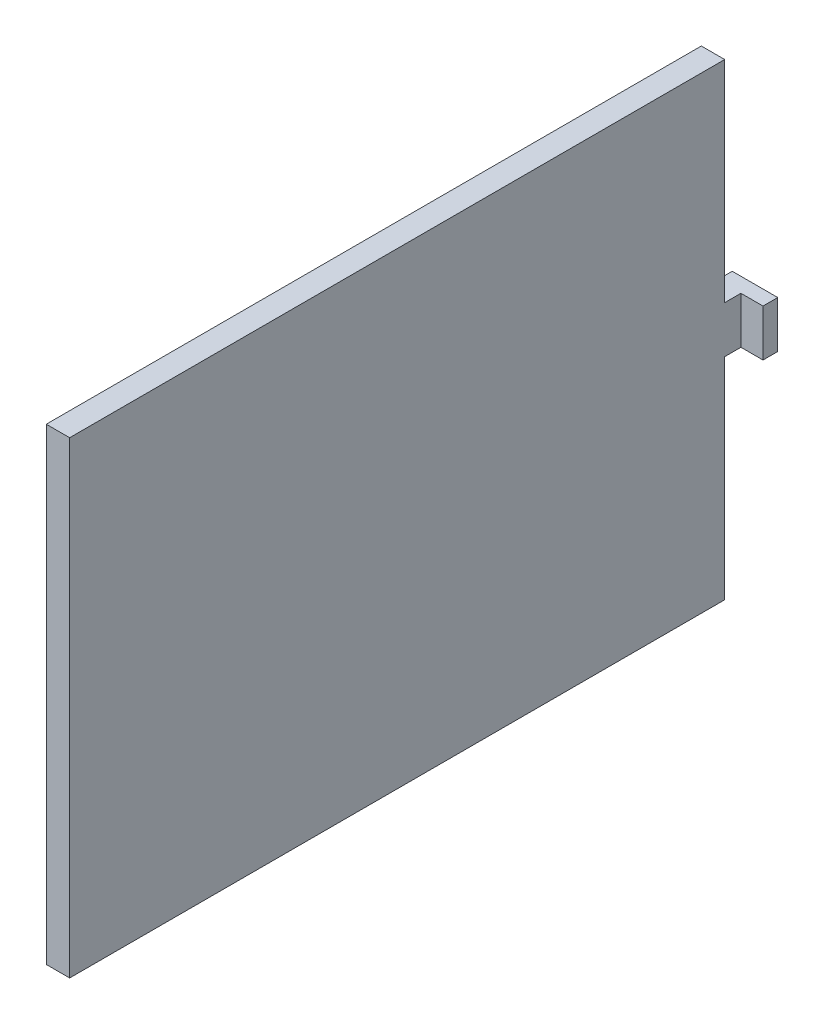
ISO-10303-21;
HEADER;
FILE_DESCRIPTION(('STEP AP214'),'2;1');
FILE_NAME('part.step','',(''),(''),'','','');
FILE_SCHEMA(('AUTOMOTIVE_DESIGN { 1 0 10303 214 1 1 1 1 }'));
ENDSEC;
DATA;
#1=APPLICATION_CONTEXT('core data for automotive mechanical design processes');
#2=APPLICATION_PROTOCOL_DEFINITION('international standard','automotive_design',2000,#1);
#3=PRODUCT_CONTEXT('',#1,'mechanical');
#4=PRODUCT('Part','Part','',(#3));
#5=PRODUCT_RELATED_PRODUCT_CATEGORY('part','',(#4));
#6=PRODUCT_DEFINITION_FORMATION('','',#4);
#7=PRODUCT_DEFINITION_CONTEXT('part definition',#1,'design');
#8=PRODUCT_DEFINITION('design','',#6,#7);
#9=PRODUCT_DEFINITION_SHAPE('','',#8);
#10=(LENGTH_UNIT() NAMED_UNIT(*) SI_UNIT(.MILLI.,.METRE.));
#11=(NAMED_UNIT(*) PLANE_ANGLE_UNIT() SI_UNIT($,.RADIAN.));
#12=(NAMED_UNIT(*) SI_UNIT($,.STERADIAN.) SOLID_ANGLE_UNIT());
#13=UNCERTAINTY_MEASURE_WITH_UNIT(LENGTH_MEASURE(1.E-05),#10,'distance_accuracy_value','');
#14=(GEOMETRIC_REPRESENTATION_CONTEXT(3) GLOBAL_UNCERTAINTY_ASSIGNED_CONTEXT((#13)) GLOBAL_UNIT_ASSIGNED_CONTEXT((#10,
#11,#12)) REPRESENTATION_CONTEXT('',''));
#15=CARTESIAN_POINT('',(0.,0.,0.));
#16=DIRECTION('',(0.,0.,1.));
#17=DIRECTION('',(1.,0.,0.));
#18=AXIS2_PLACEMENT_3D('',#15,#16,#17);
#19=CARTESIAN_POINT('',(0.,0.,0.));
#20=DIRECTION('',(0.,0.,-1.));
#21=DIRECTION('',(-1.,0.,0.));
#22=AXIS2_PLACEMENT_3D('',#19,#20,#21);
#23=PLANE('',#22);
#24=DIRECTION('',(0.,-1.,0.));
#25=VECTOR('',#24,1.);
#26=CARTESIAN_POINT('',(-1.5875,-31.75,0.));
#27=LINE('',#26,#25);
#28=CARTESIAN_POINT('',(-1.5875,-3.175,0.));
#29=VERTEX_POINT('',#28);
#30=CARTESIAN_POINT('',(-1.5875,-31.75,0.));
#31=VERTEX_POINT('',#30);
#32=EDGE_CURVE('E60',#29,#31,#27,.T.);
#33=ORIENTED_EDGE('',*,*,#32,.F.);
#34=DIRECTION('',(1.,0.,0.));
#35=VECTOR('',#34,1.);
#36=CARTESIAN_POINT('',(-1.5875,-3.175,0.));
#37=LINE('',#36,#35);
#38=CARTESIAN_POINT('',(1.5875,-3.175,0.));
#39=VERTEX_POINT('',#38);
#40=EDGE_CURVE('E55',#29,#39,#37,.T.);
#41=ORIENTED_EDGE('',*,*,#40,.T.);
#42=DIRECTION('',(0.,1.,0.));
#43=VECTOR('',#42,1.);
#44=CARTESIAN_POINT('',(1.5875,-31.75,0.));
#45=LINE('',#44,#43);
#46=CARTESIAN_POINT('',(1.5875,-31.75,0.));
#47=VERTEX_POINT('',#46);
#48=EDGE_CURVE('E128',#47,#39,#45,.T.);
#49=ORIENTED_EDGE('',*,*,#48,.F.);
#50=DIRECTION('',(1.,0.,0.));
#51=VECTOR('',#50,1.);
#52=CARTESIAN_POINT('',(-1.5875,-31.75,0.));
#53=LINE('',#52,#51);
#54=EDGE_CURVE('E129',#31,#47,#53,.T.);
#55=ORIENTED_EDGE('',*,*,#54,.F.);
#56=EDGE_LOOP('',(#33,#41,#49,#55));
#57=FACE_BOUND('',#56,.T.);
#58=ADVANCED_FACE('F39',(#57),#23,.T.);
#59=CARTESIAN_POINT('',(-1.5875,-31.75,88.9));
#60=DIRECTION('',(1.,0.,0.));
#61=DIRECTION('',(0.,1.,0.));
#62=AXIS2_PLACEMENT_3D('',#59,#60,#61);
#63=PLANE('',#62);
#64=CARTESIAN_POINT('',(-1.5875,31.75,0.));
#65=VERTEX_POINT('',#64);
#66=CARTESIAN_POINT('',(-1.5875,3.175,0.));
#67=VERTEX_POINT('',#66);
#68=EDGE_CURVE('E203',#65,#67,#27,.T.);
#69=ORIENTED_EDGE('',*,*,#68,.T.);
#70=DIRECTION('',(0.,0.,1.));
#71=VECTOR('',#70,1.);
#72=CARTESIAN_POINT('',(-1.5875,3.175,-4.2));
#73=LINE('',#72,#71);
#74=CARTESIAN_POINT('',(-1.5875,3.175,-4.2));
#75=VERTEX_POINT('',#74);
#76=EDGE_CURVE('E144',#75,#67,#73,.T.);
#77=ORIENTED_EDGE('',*,*,#76,.F.);
#78=DIRECTION('',(0.,-1.,0.));
#79=VECTOR('',#78,1.);
#80=CARTESIAN_POINT('',(-1.5875,3.175,-4.2));
#81=LINE('',#80,#79);
#82=CARTESIAN_POINT('',(-1.5875,-3.175,-4.2));
#83=VERTEX_POINT('',#82);
#84=EDGE_CURVE('E162',#75,#83,#81,.T.);
#85=ORIENTED_EDGE('',*,*,#84,.T.);
#86=DIRECTION('',(0.,0.,1.));
#87=VECTOR('',#86,1.);
#88=CARTESIAN_POINT('',(-1.5875,-3.175,-4.2));
#89=LINE('',#88,#87);
#90=EDGE_CURVE('E146',#83,#29,#89,.T.);
#91=ORIENTED_EDGE('',*,*,#90,.T.);
#92=ORIENTED_EDGE('',*,*,#32,.T.);
#93=DIRECTION('',(0.,0.,-1.));
#94=VECTOR('',#93,1.);
#95=CARTESIAN_POINT('',(-1.5875,-31.75,88.9));
#96=LINE('',#95,#94);
#97=CARTESIAN_POINT('',(-1.5875,-31.75,88.9));
#98=VERTEX_POINT('',#97);
#99=EDGE_CURVE('E11',#98,#31,#96,.T.);
#100=ORIENTED_EDGE('',*,*,#99,.F.);
#101=DIRECTION('',(0.,-1.,0.));
#102=VECTOR('',#101,1.);
#103=CARTESIAN_POINT('',(-1.5875,-31.75,88.9));
#104=LINE('',#103,#102);
#105=CARTESIAN_POINT('',(-1.5875,31.75,88.9));
#106=VERTEX_POINT('',#105);
#107=EDGE_CURVE('E189',#106,#98,#104,.T.);
#108=ORIENTED_EDGE('',*,*,#107,.F.);
#109=DIRECTION('',(0.,0.,-1.));
#110=VECTOR('',#109,1.);
#111=CARTESIAN_POINT('',(-1.5875,31.75,88.9));
#112=LINE('',#111,#110);
#113=EDGE_CURVE('E202',#106,#65,#112,.T.);
#114=ORIENTED_EDGE('',*,*,#113,.T.);
#115=EDGE_LOOP('',(#69,#77,#85,#91,#92,#100,#108,#114));
#116=FACE_BOUND('',#115,.T.);
#117=ADVANCED_FACE('F41',(#116),#63,.F.);
#118=CARTESIAN_POINT('',(-1.5875,-31.75,88.9));
#119=DIRECTION('',(0.,1.,0.));
#120=DIRECTION('',(0.,0.,1.));
#121=AXIS2_PLACEMENT_3D('',#118,#119,#120);
#122=PLANE('',#121);
#123=ORIENTED_EDGE('',*,*,#54,.T.);
#124=DIRECTION('',(0.,0.,-1.));
#125=VECTOR('',#124,1.);
#126=CARTESIAN_POINT('',(1.5875,-31.75,88.9));
#127=LINE('',#126,#125);
#128=CARTESIAN_POINT('',(1.5875,-31.75,88.9));
#129=VERTEX_POINT('',#128);
#130=EDGE_CURVE('E48',#129,#47,#127,.T.);
#131=ORIENTED_EDGE('',*,*,#130,.F.);
#132=DIRECTION('',(1.,0.,0.));
#133=VECTOR('',#132,1.);
#134=CARTESIAN_POINT('',(-1.5875,-31.75,88.9));
#135=LINE('',#134,#133);
#136=EDGE_CURVE('E193',#98,#129,#135,.T.);
#137=ORIENTED_EDGE('',*,*,#136,.F.);
#138=ORIENTED_EDGE('',*,*,#99,.T.);
#139=EDGE_LOOP('',(#123,#131,#137,#138));
#140=FACE_BOUND('',#139,.T.);
#141=ADVANCED_FACE('F223',(#140),#122,.F.);
#142=CARTESIAN_POINT('',(1.5875,-31.75,88.9));
#143=DIRECTION('',(-1.,0.,0.));
#144=DIRECTION('',(0.,0.,1.));
#145=AXIS2_PLACEMENT_3D('',#142,#143,#144);
#146=PLANE('',#145);
#147=ORIENTED_EDGE('',*,*,#48,.T.);
#148=DIRECTION('',(0.,0.,-1.));
#149=VECTOR('',#148,1.);
#150=CARTESIAN_POINT('',(1.5875,-3.175,0.));
#151=LINE('',#150,#149);
#152=CARTESIAN_POINT('',(1.5875,-3.175,-2.2));
#153=VERTEX_POINT('',#152);
#154=EDGE_CURVE('E165',#39,#153,#151,.T.);
#155=ORIENTED_EDGE('',*,*,#154,.T.);
#156=DIRECTION('',(0.,-1.,0.));
#157=VECTOR('',#156,1.);
#158=CARTESIAN_POINT('',(1.5875,3.175,-2.2));
#159=LINE('',#158,#157);
#160=CARTESIAN_POINT('',(1.5875,3.175,-2.2));
#161=VERTEX_POINT('',#160);
#162=EDGE_CURVE('E135',#161,#153,#159,.T.);
#163=ORIENTED_EDGE('',*,*,#162,.F.);
#164=DIRECTION('',(0.,0.,-1.));
#165=VECTOR('',#164,1.);
#166=CARTESIAN_POINT('',(1.5875,3.175,0.));
#167=LINE('',#166,#165);
#168=CARTESIAN_POINT('',(1.5875,3.175,0.));
#169=VERTEX_POINT('',#168);
#170=EDGE_CURVE('E132',#169,#161,#167,.T.);
#171=ORIENTED_EDGE('',*,*,#170,.F.);
#172=CARTESIAN_POINT('',(1.5875,31.75,0.));
#173=VERTEX_POINT('',#172);
#174=EDGE_CURVE('E116',#169,#173,#45,.T.);
#175=ORIENTED_EDGE('',*,*,#174,.T.);
#176=DIRECTION('',(0.,0.,-1.));
#177=VECTOR('',#176,1.);
#178=CARTESIAN_POINT('',(1.5875,31.75,88.9));
#179=LINE('',#178,#177);
#180=CARTESIAN_POINT('',(1.5875,31.75,88.9));
#181=VERTEX_POINT('',#180);
#182=EDGE_CURVE('E214',#181,#173,#179,.T.);
#183=ORIENTED_EDGE('',*,*,#182,.F.);
#184=DIRECTION('',(0.,1.,0.));
#185=VECTOR('',#184,1.);
#186=CARTESIAN_POINT('',(1.5875,-31.75,88.9));
#187=LINE('',#186,#185);
#188=EDGE_CURVE('E196',#129,#181,#187,.T.);
#189=ORIENTED_EDGE('',*,*,#188,.F.);
#190=ORIENTED_EDGE('',*,*,#130,.T.);
#191=EDGE_LOOP('',(#147,#155,#163,#171,#175,#183,#189,#190));
#192=FACE_BOUND('',#191,.T.);
#193=ADVANCED_FACE('F133',(#192),#146,.F.);
#194=CARTESIAN_POINT('',(-1.5875,31.75,88.9));
#195=DIRECTION('',(0.,-1.,0.));
#196=DIRECTION('',(0.,0.,-1.));
#197=AXIS2_PLACEMENT_3D('',#194,#195,#196);
#198=PLANE('',#197);
#199=DIRECTION('',(-1.,0.,0.));
#200=VECTOR('',#199,1.);
#201=CARTESIAN_POINT('',(-1.5875,31.75,0.));
#202=LINE('',#201,#200);
#203=EDGE_CURVE('E123',#173,#65,#202,.T.);
#204=ORIENTED_EDGE('',*,*,#203,.T.);
#205=ORIENTED_EDGE('',*,*,#113,.F.);
#206=DIRECTION('',(-1.,0.,0.));
#207=VECTOR('',#206,1.);
#208=CARTESIAN_POINT('',(-1.5875,31.75,88.9));
#209=LINE('',#208,#207);
#210=EDGE_CURVE('E199',#181,#106,#209,.T.);
#211=ORIENTED_EDGE('',*,*,#210,.F.);
#212=ORIENTED_EDGE('',*,*,#182,.T.);
#213=EDGE_LOOP('',(#204,#205,#211,#212));
#214=FACE_BOUND('',#213,.T.);
#215=ADVANCED_FACE('F247',(#214),#198,.F.);
#216=CARTESIAN_POINT('',(0.,0.,88.9));
#217=DIRECTION('',(0.,0.,-1.));
#218=DIRECTION('',(-1.,0.,0.));
#219=AXIS2_PLACEMENT_3D('',#216,#217,#218);
#220=PLANE('',#219);
#221=ORIENTED_EDGE('',*,*,#107,.T.);
#222=ORIENTED_EDGE('',*,*,#136,.T.);
#223=ORIENTED_EDGE('',*,*,#188,.T.);
#224=ORIENTED_EDGE('',*,*,#210,.T.);
#225=EDGE_LOOP('',(#221,#222,#223,#224));
#226=FACE_BOUND('',#225,.T.);
#227=ADVANCED_FACE('F249',(#226),#220,.F.);
#228=DIRECTION('',(1.,0.,0.));
#229=VECTOR('',#228,1.);
#230=CARTESIAN_POINT('',(-1.5875,3.175,0.));
#231=LINE('',#230,#229);
#232=EDGE_CURVE('E121',#67,#169,#231,.T.);
#233=ORIENTED_EDGE('',*,*,#232,.F.);
#234=ORIENTED_EDGE('',*,*,#68,.F.);
#235=ORIENTED_EDGE('',*,*,#203,.F.);
#236=ORIENTED_EDGE('',*,*,#174,.F.);
#237=EDGE_LOOP('',(#233,#234,#235,#236));
#238=FACE_BOUND('',#237,.T.);
#239=ADVANCED_FACE('F118',(#238),#23,.T.);
#240=CARTESIAN_POINT('',(1.5875,3.175,-2.2));
#241=DIRECTION('',(0.,0.,-1.));
#242=DIRECTION('',(-1.,0.,0.));
#243=AXIS2_PLACEMENT_3D('',#240,#241,#242);
#244=PLANE('',#243);
#245=DIRECTION('',(1.,0.,0.));
#246=VECTOR('',#245,1.);
#247=CARTESIAN_POINT('',(1.5875,-3.175,-2.2));
#248=LINE('',#247,#246);
#249=CARTESIAN_POINT('',(4.5847,-3.175,-2.2));
#250=VERTEX_POINT('',#249);
#251=EDGE_CURVE('E168',#153,#250,#248,.T.);
#252=ORIENTED_EDGE('',*,*,#251,.T.);
#253=DIRECTION('',(0.,-1.,0.));
#254=VECTOR('',#253,1.);
#255=CARTESIAN_POINT('',(4.5847,3.175,-2.2));
#256=LINE('',#255,#254);
#257=CARTESIAN_POINT('',(4.5847,3.175,-2.2));
#258=VERTEX_POINT('',#257);
#259=EDGE_CURVE('E183',#258,#250,#256,.T.);
#260=ORIENTED_EDGE('',*,*,#259,.F.);
#261=DIRECTION('',(1.,0.,0.));
#262=VECTOR('',#261,1.);
#263=CARTESIAN_POINT('',(1.5875,3.175,-2.2));
#264=LINE('',#263,#262);
#265=EDGE_CURVE('E139',#161,#258,#264,.T.);
#266=ORIENTED_EDGE('',*,*,#265,.F.);
#267=ORIENTED_EDGE('',*,*,#162,.T.);
#268=EDGE_LOOP('',(#252,#260,#266,#267));
#269=FACE_BOUND('',#268,.T.);
#270=ADVANCED_FACE('F235',(#269),#244,.F.);
#271=CARTESIAN_POINT('',(4.5847,3.175,-2.2));
#272=DIRECTION('',(-1.,0.,0.));
#273=DIRECTION('',(0.,0.,1.));
#274=AXIS2_PLACEMENT_3D('',#271,#272,#273);
#275=PLANE('',#274);
#276=DIRECTION('',(0.,0.,-1.));
#277=VECTOR('',#276,1.);
#278=CARTESIAN_POINT('',(4.5847,-3.175,-2.2));
#279=LINE('',#278,#277);
#280=CARTESIAN_POINT('',(4.5847,-3.175,-4.2));
#281=VERTEX_POINT('',#280);
#282=EDGE_CURVE('E171',#250,#281,#279,.T.);
#283=ORIENTED_EDGE('',*,*,#282,.T.);
#284=DIRECTION('',(0.,-1.,0.));
#285=VECTOR('',#284,1.);
#286=CARTESIAN_POINT('',(4.5847,3.175,-4.2));
#287=LINE('',#286,#285);
#288=CARTESIAN_POINT('',(4.5847,3.175,-4.2));
#289=VERTEX_POINT('',#288);
#290=EDGE_CURVE('E179',#289,#281,#287,.T.);
#291=ORIENTED_EDGE('',*,*,#290,.F.);
#292=DIRECTION('',(0.,0.,-1.));
#293=VECTOR('',#292,1.);
#294=CARTESIAN_POINT('',(4.5847,3.175,-2.2));
#295=LINE('',#294,#293);
#296=EDGE_CURVE('E154',#258,#289,#295,.T.);
#297=ORIENTED_EDGE('',*,*,#296,.F.);
#298=ORIENTED_EDGE('',*,*,#259,.T.);
#299=EDGE_LOOP('',(#283,#291,#297,#298));
#300=FACE_BOUND('',#299,.T.);
#301=ADVANCED_FACE('F241',(#300),#275,.F.);
#302=CARTESIAN_POINT('',(4.5847,3.175,-4.2));
#303=DIRECTION('',(0.,0.,1.));
#304=DIRECTION('',(1.,0.,0.));
#305=AXIS2_PLACEMENT_3D('',#302,#303,#304);
#306=PLANE('',#305);
#307=DIRECTION('',(-1.,0.,0.));
#308=VECTOR('',#307,1.);
#309=CARTESIAN_POINT('',(4.5847,-3.175,-4.2));
#310=LINE('',#309,#308);
#311=EDGE_CURVE('E149',#281,#83,#310,.T.);
#312=ORIENTED_EDGE('',*,*,#311,.T.);
#313=ORIENTED_EDGE('',*,*,#84,.F.);
#314=DIRECTION('',(-1.,0.,0.));
#315=VECTOR('',#314,1.);
#316=CARTESIAN_POINT('',(4.5847,3.175,-4.2));
#317=LINE('',#316,#315);
#318=EDGE_CURVE('E157',#289,#75,#317,.T.);
#319=ORIENTED_EDGE('',*,*,#318,.F.);
#320=ORIENTED_EDGE('',*,*,#290,.T.);
#321=EDGE_LOOP('',(#312,#313,#319,#320));
#322=FACE_BOUND('',#321,.T.);
#323=ADVANCED_FACE('F243',(#322),#306,.F.);
#324=CARTESIAN_POINT('',(0.,3.175,0.));
#325=DIRECTION('',(0.,1.,0.));
#326=DIRECTION('',(0.,0.,1.));
#327=AXIS2_PLACEMENT_3D('',#324,#325,#326);
#328=PLANE('',#327);
#329=ORIENTED_EDGE('',*,*,#232,.T.);
#330=ORIENTED_EDGE('',*,*,#170,.T.);
#331=ORIENTED_EDGE('',*,*,#265,.T.);
#332=ORIENTED_EDGE('',*,*,#296,.T.);
#333=ORIENTED_EDGE('',*,*,#318,.T.);
#334=ORIENTED_EDGE('',*,*,#76,.T.);
#335=EDGE_LOOP('',(#329,#330,#331,#332,#333,#334));
#336=FACE_BOUND('',#335,.T.);
#337=ADVANCED_FACE('F142',(#336),#328,.T.);
#338=CARTESIAN_POINT('',(0.,-3.175,0.));
#339=DIRECTION('',(0.,1.,0.));
#340=DIRECTION('',(0.,0.,1.));
#341=AXIS2_PLACEMENT_3D('',#338,#339,#340);
#342=PLANE('',#341);
#343=ORIENTED_EDGE('',*,*,#40,.F.);
#344=ORIENTED_EDGE('',*,*,#90,.F.);
#345=ORIENTED_EDGE('',*,*,#311,.F.);
#346=ORIENTED_EDGE('',*,*,#282,.F.);
#347=ORIENTED_EDGE('',*,*,#251,.F.);
#348=ORIENTED_EDGE('',*,*,#154,.F.);
#349=EDGE_LOOP('',(#343,#344,#345,#346,#347,#348));
#350=FACE_BOUND('',#349,.T.);
#351=ADVANCED_FACE('F231',(#350),#342,.F.);
#352=CLOSED_SHELL('',(#58,#117,#141,#193,#215,#227,#239,#270,#301,#323,#337,#351));
#353=MANIFOLD_SOLID_BREP('B2',#352);
#354=ADVANCED_BREP_SHAPE_REPRESENTATION('',(#18,#353),#14);
#355=SHAPE_DEFINITION_REPRESENTATION(#9,#354);
ENDSEC;
END-ISO-10303-21;
